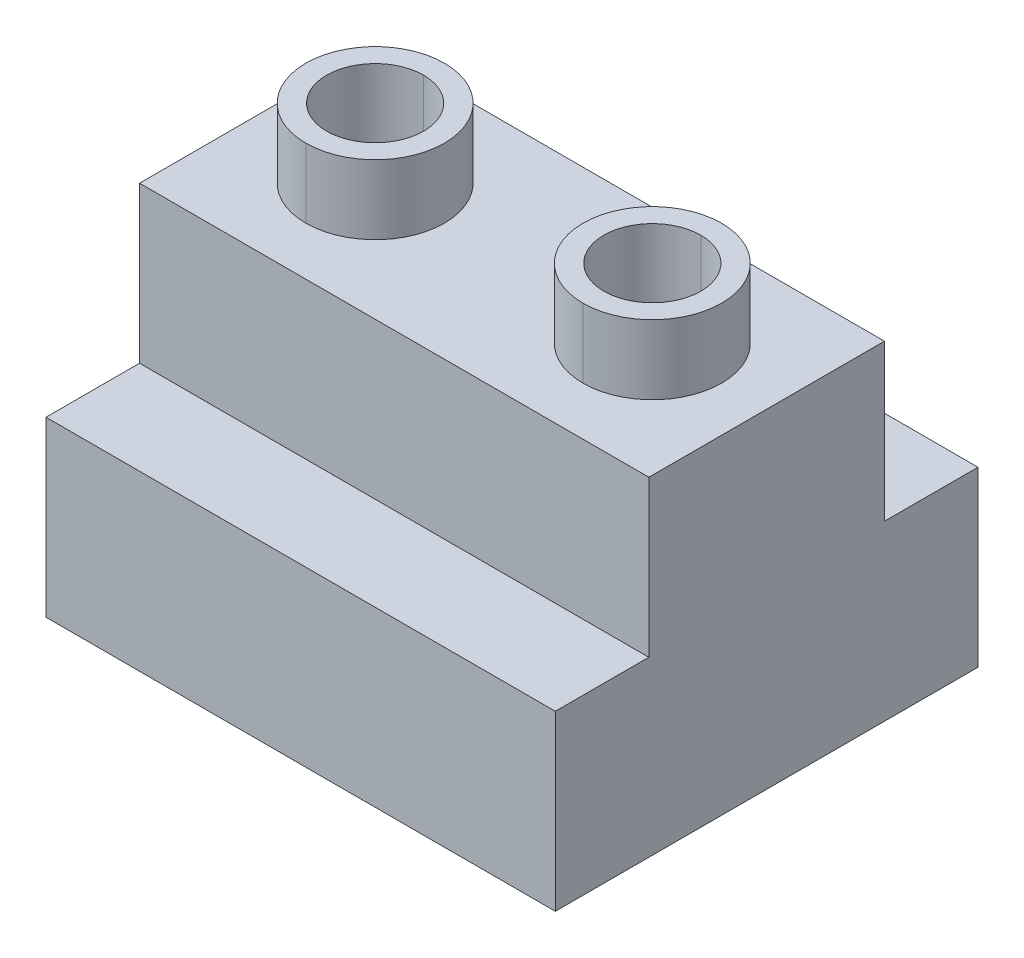
ISO-10303-21;
HEADER;
FILE_DESCRIPTION(('STEP AP214'),'2;1');
FILE_NAME('part.step','',(''),(''),'','','');
FILE_SCHEMA(('AUTOMOTIVE_DESIGN { 1 0 10303 214 1 1 1 1 }'));
ENDSEC;
DATA;
#1=APPLICATION_CONTEXT('core data for automotive mechanical design processes');
#2=APPLICATION_PROTOCOL_DEFINITION('international standard','automotive_design',2000,#1);
#3=PRODUCT_CONTEXT('',#1,'mechanical');
#4=PRODUCT('Part','Part','',(#3));
#5=PRODUCT_RELATED_PRODUCT_CATEGORY('part','',(#4));
#6=PRODUCT_DEFINITION_FORMATION('','',#4);
#7=PRODUCT_DEFINITION_CONTEXT('part definition',#1,'design');
#8=PRODUCT_DEFINITION('design','',#6,#7);
#9=PRODUCT_DEFINITION_SHAPE('','',#8);
#10=(LENGTH_UNIT() NAMED_UNIT(*) SI_UNIT(.MILLI.,.METRE.));
#11=(NAMED_UNIT(*) PLANE_ANGLE_UNIT() SI_UNIT($,.RADIAN.));
#12=(NAMED_UNIT(*) SI_UNIT($,.STERADIAN.) SOLID_ANGLE_UNIT());
#13=UNCERTAINTY_MEASURE_WITH_UNIT(LENGTH_MEASURE(1.E-05),#10,'distance_accuracy_value','');
#14=(GEOMETRIC_REPRESENTATION_CONTEXT(3) GLOBAL_UNCERTAINTY_ASSIGNED_CONTEXT((#13)) GLOBAL_UNIT_ASSIGNED_CONTEXT((#10,
#11,#12)) REPRESENTATION_CONTEXT('',''));
#15=CARTESIAN_POINT('',(0.,0.,0.));
#16=DIRECTION('',(0.,0.,1.));
#17=DIRECTION('',(1.,0.,0.));
#18=AXIS2_PLACEMENT_3D('',#15,#16,#17);
#19=CARTESIAN_POINT('',(-14.7,5.,3.4));
#20=DIRECTION('',(0.,1.,0.));
#21=DIRECTION('',(0.,0.,1.));
#22=AXIS2_PLACEMENT_3D('',#19,#20,#21);
#23=PLANE('',#22);
#24=DIRECTION('',(0.,0.,1.));
#25=VECTOR('',#24,1.);
#26=CARTESIAN_POINT('',(0.,5.,3.4));
#27=LINE('',#26,#25);
#28=CARTESIAN_POINT('',(0.,5.,3.4));
#29=VERTEX_POINT('',#28);
#30=CARTESIAN_POINT('',(0.,5.,6.1));
#31=VERTEX_POINT('',#30);
#32=EDGE_CURVE('E11',#29,#31,#27,.T.);
#33=ORIENTED_EDGE('',*,*,#32,.F.);
#34=DIRECTION('',(1.,0.,0.));
#35=VECTOR('',#34,1.);
#36=CARTESIAN_POINT('',(-14.7,5.,3.4));
#37=LINE('',#36,#35);
#38=CARTESIAN_POINT('',(-14.7,5.,3.4));
#39=VERTEX_POINT('',#38);
#40=EDGE_CURVE('E24',#39,#29,#37,.T.);
#41=ORIENTED_EDGE('',*,*,#40,.F.);
#42=DIRECTION('',(0.,0.,1.));
#43=VECTOR('',#42,1.);
#44=CARTESIAN_POINT('',(-14.7,5.,3.4));
#45=LINE('',#44,#43);
#46=CARTESIAN_POINT('',(-14.7,5.,6.1));
#47=VERTEX_POINT('',#46);
#48=EDGE_CURVE('E445',#39,#47,#45,.T.);
#49=ORIENTED_EDGE('',*,*,#48,.T.);
#50=DIRECTION('',(1.,0.,0.));
#51=VECTOR('',#50,1.);
#52=CARTESIAN_POINT('',(-14.7,5.,6.1));
#53=LINE('',#52,#51);
#54=EDGE_CURVE('E441',#47,#31,#53,.T.);
#55=ORIENTED_EDGE('',*,*,#54,.T.);
#56=EDGE_LOOP('',(#33,#41,#49,#55));
#57=FACE_BOUND('',#56,.T.);
#58=ADVANCED_FACE('F16',(#57),#23,.T.);
#59=CARTESIAN_POINT('',(-14.7,5.,6.1));
#60=DIRECTION('',(0.,0.,1.));
#61=DIRECTION('',(1.,0.,0.));
#62=AXIS2_PLACEMENT_3D('',#59,#60,#61);
#63=PLANE('',#62);
#64=DIRECTION('',(0.,-1.,0.));
#65=VECTOR('',#64,1.);
#66=CARTESIAN_POINT('',(0.,5.,6.1));
#67=LINE('',#66,#65);
#68=CARTESIAN_POINT('',(0.,0.,6.1));
#69=VERTEX_POINT('',#68);
#70=EDGE_CURVE('E436',#31,#69,#67,.T.);
#71=ORIENTED_EDGE('',*,*,#70,.F.);
#72=ORIENTED_EDGE('',*,*,#54,.F.);
#73=DIRECTION('',(0.,-1.,0.));
#74=VECTOR('',#73,1.);
#75=CARTESIAN_POINT('',(-14.7,5.,6.1));
#76=LINE('',#75,#74);
#77=CARTESIAN_POINT('',(-14.7,0.,6.1));
#78=VERTEX_POINT('',#77);
#79=EDGE_CURVE('E432',#47,#78,#76,.T.);
#80=ORIENTED_EDGE('',*,*,#79,.T.);
#81=DIRECTION('',(1.,0.,0.));
#82=VECTOR('',#81,1.);
#83=CARTESIAN_POINT('',(-14.7,0.,6.1));
#84=LINE('',#83,#82);
#85=EDGE_CURVE('E428',#78,#69,#84,.T.);
#86=ORIENTED_EDGE('',*,*,#85,.T.);
#87=EDGE_LOOP('',(#71,#72,#80,#86));
#88=FACE_BOUND('',#87,.T.);
#89=ADVANCED_FACE('F475',(#88),#63,.T.);
#90=CARTESIAN_POINT('',(-14.7,0.,6.1));
#91=DIRECTION('',(0.,-1.,0.));
#92=DIRECTION('',(0.,0.,-1.));
#93=AXIS2_PLACEMENT_3D('',#90,#91,#92);
#94=PLANE('',#93);
#95=DIRECTION('',(0.,0.,-1.));
#96=VECTOR('',#95,1.);
#97=CARTESIAN_POINT('',(0.,0.,6.1));
#98=LINE('',#97,#96);
#99=CARTESIAN_POINT('',(0.,0.,-6.1));
#100=VERTEX_POINT('',#99);
#101=EDGE_CURVE('E423',#69,#100,#98,.T.);
#102=ORIENTED_EDGE('',*,*,#101,.F.);
#103=ORIENTED_EDGE('',*,*,#85,.F.);
#104=DIRECTION('',(0.,0.,-1.));
#105=VECTOR('',#104,1.);
#106=CARTESIAN_POINT('',(-14.7,0.,6.1));
#107=LINE('',#106,#105);
#108=CARTESIAN_POINT('',(-14.7,0.,-6.1));
#109=VERTEX_POINT('',#108);
#110=EDGE_CURVE('E419',#78,#109,#107,.T.);
#111=ORIENTED_EDGE('',*,*,#110,.T.);
#112=DIRECTION('',(1.,0.,0.));
#113=VECTOR('',#112,1.);
#114=CARTESIAN_POINT('',(-14.7,0.,-6.1));
#115=LINE('',#114,#113);
#116=EDGE_CURVE('E415',#109,#100,#115,.T.);
#117=ORIENTED_EDGE('',*,*,#116,.T.);
#118=EDGE_LOOP('',(#102,#103,#111,#117));
#119=FACE_BOUND('',#118,.T.);
#120=ADVANCED_FACE('F480',(#119),#94,.T.);
#121=CARTESIAN_POINT('',(-14.7,0.,-6.1));
#122=DIRECTION('',(0.,0.,-1.));
#123=DIRECTION('',(-1.,0.,0.));
#124=AXIS2_PLACEMENT_3D('',#121,#122,#123);
#125=PLANE('',#124);
#126=DIRECTION('',(0.,1.,0.));
#127=VECTOR('',#126,1.);
#128=CARTESIAN_POINT('',(0.,0.,-6.1));
#129=LINE('',#128,#127);
#130=CARTESIAN_POINT('',(0.,5.,-6.1));
#131=VERTEX_POINT('',#130);
#132=EDGE_CURVE('E410',#100,#131,#129,.T.);
#133=ORIENTED_EDGE('',*,*,#132,.F.);
#134=ORIENTED_EDGE('',*,*,#116,.F.);
#135=DIRECTION('',(0.,1.,0.));
#136=VECTOR('',#135,1.);
#137=CARTESIAN_POINT('',(-14.7,0.,-6.1));
#138=LINE('',#137,#136);
#139=CARTESIAN_POINT('',(-14.7,5.,-6.1));
#140=VERTEX_POINT('',#139);
#141=EDGE_CURVE('E406',#109,#140,#138,.T.);
#142=ORIENTED_EDGE('',*,*,#141,.T.);
#143=DIRECTION('',(1.,0.,0.));
#144=VECTOR('',#143,1.);
#145=CARTESIAN_POINT('',(-14.7,5.,-6.1));
#146=LINE('',#145,#144);
#147=EDGE_CURVE('E402',#140,#131,#146,.T.);
#148=ORIENTED_EDGE('',*,*,#147,.T.);
#149=EDGE_LOOP('',(#133,#134,#142,#148));
#150=FACE_BOUND('',#149,.T.);
#151=ADVANCED_FACE('F484',(#150),#125,.T.);
#152=CARTESIAN_POINT('',(-14.7,5.,-6.1));
#153=DIRECTION('',(0.,1.,0.));
#154=DIRECTION('',(0.,0.,1.));
#155=AXIS2_PLACEMENT_3D('',#152,#153,#154);
#156=PLANE('',#155);
#157=DIRECTION('',(0.,0.,1.));
#158=VECTOR('',#157,1.);
#159=CARTESIAN_POINT('',(0.,5.,-6.1));
#160=LINE('',#159,#158);
#161=CARTESIAN_POINT('',(0.,5.,-3.4));
#162=VERTEX_POINT('',#161);
#163=EDGE_CURVE('E397',#131,#162,#160,.T.);
#164=ORIENTED_EDGE('',*,*,#163,.F.);
#165=ORIENTED_EDGE('',*,*,#147,.F.);
#166=DIRECTION('',(0.,0.,1.));
#167=VECTOR('',#166,1.);
#168=CARTESIAN_POINT('',(-14.7,5.,-6.1));
#169=LINE('',#168,#167);
#170=CARTESIAN_POINT('',(-14.7,5.,-3.4));
#171=VERTEX_POINT('',#170);
#172=EDGE_CURVE('E393',#140,#171,#169,.T.);
#173=ORIENTED_EDGE('',*,*,#172,.T.);
#174=DIRECTION('',(1.,0.,0.));
#175=VECTOR('',#174,1.);
#176=CARTESIAN_POINT('',(-14.7,5.,-3.4));
#177=LINE('',#176,#175);
#178=EDGE_CURVE('E389',#171,#162,#177,.T.);
#179=ORIENTED_EDGE('',*,*,#178,.T.);
#180=EDGE_LOOP('',(#164,#165,#173,#179));
#181=FACE_BOUND('',#180,.T.);
#182=ADVANCED_FACE('F489',(#181),#156,.T.);
#183=CARTESIAN_POINT('',(-14.7,5.,-3.4));
#184=DIRECTION('',(0.,0.,-1.));
#185=DIRECTION('',(-1.,0.,0.));
#186=AXIS2_PLACEMENT_3D('',#183,#184,#185);
#187=PLANE('',#186);
#188=DIRECTION('',(0.,1.,0.));
#189=VECTOR('',#188,1.);
#190=CARTESIAN_POINT('',(0.,5.,-3.4));
#191=LINE('',#190,#189);
#192=CARTESIAN_POINT('',(0.,9.5,-3.4));
#193=VERTEX_POINT('',#192);
#194=EDGE_CURVE('E384',#162,#193,#191,.T.);
#195=ORIENTED_EDGE('',*,*,#194,.F.);
#196=ORIENTED_EDGE('',*,*,#178,.F.);
#197=DIRECTION('',(0.,1.,0.));
#198=VECTOR('',#197,1.);
#199=CARTESIAN_POINT('',(-14.7,5.,-3.4));
#200=LINE('',#199,#198);
#201=CARTESIAN_POINT('',(-14.7,9.5,-3.4));
#202=VERTEX_POINT('',#201);
#203=EDGE_CURVE('E380',#171,#202,#200,.T.);
#204=ORIENTED_EDGE('',*,*,#203,.T.);
#205=DIRECTION('',(1.,0.,0.));
#206=VECTOR('',#205,1.);
#207=CARTESIAN_POINT('',(-14.7,9.5,-3.4));
#208=LINE('',#207,#206);
#209=EDGE_CURVE('E376',#202,#193,#208,.T.);
#210=ORIENTED_EDGE('',*,*,#209,.T.);
#211=EDGE_LOOP('',(#195,#196,#204,#210));
#212=FACE_BOUND('',#211,.T.);
#213=ADVANCED_FACE('F492',(#212),#187,.T.);
#214=CARTESIAN_POINT('',(-14.7,9.5,-3.4));
#215=DIRECTION('',(0.,1.,0.));
#216=DIRECTION('',(0.,0.,1.));
#217=AXIS2_PLACEMENT_3D('',#214,#215,#216);
#218=PLANE('',#217);
#219=CARTESIAN_POINT('',(-11.3,9.5,0.));
#220=DIRECTION('',(0.,1.,0.));
#221=DIRECTION('',(0.,0.,1.));
#222=AXIS2_PLACEMENT_3D('',#219,#220,#221);
#223=CIRCLE('',#222,2.);
#224=CARTESIAN_POINT('',(-11.3,9.5,-2.));
#225=VERTEX_POINT('',#224);
#226=CARTESIAN_POINT('',(-11.3,9.5,2.));
#227=VERTEX_POINT('',#226);
#228=EDGE_CURVE('E371',#225,#227,#223,.T.);
#229=ORIENTED_EDGE('',*,*,#228,.F.);
#230=CARTESIAN_POINT('',(-11.3,9.5,0.));
#231=DIRECTION('',(0.,1.,0.));
#232=DIRECTION('',(0.,0.,1.));
#233=AXIS2_PLACEMENT_3D('',#230,#231,#232);
#234=CIRCLE('',#233,2.);
#235=EDGE_CURVE('E366',#227,#225,#234,.T.);
#236=ORIENTED_EDGE('',*,*,#235,.F.);
#237=EDGE_LOOP('',(#229,#236));
#238=FACE_BOUND('',#237,.T.);
#239=CARTESIAN_POINT('',(-3.3,9.5,0.));
#240=DIRECTION('',(0.,1.,0.));
#241=DIRECTION('',(0.,0.,1.));
#242=AXIS2_PLACEMENT_3D('',#239,#240,#241);
#243=CIRCLE('',#242,2.);
#244=CARTESIAN_POINT('',(-3.3,9.5,-2.));
#245=VERTEX_POINT('',#244);
#246=CARTESIAN_POINT('',(-3.3,9.5,2.));
#247=VERTEX_POINT('',#246);
#248=EDGE_CURVE('E361',#245,#247,#243,.T.);
#249=ORIENTED_EDGE('',*,*,#248,.F.);
#250=CARTESIAN_POINT('',(-3.3,9.5,0.));
#251=DIRECTION('',(0.,1.,0.));
#252=DIRECTION('',(0.,0.,1.));
#253=AXIS2_PLACEMENT_3D('',#250,#251,#252);
#254=CIRCLE('',#253,2.);
#255=EDGE_CURVE('E356',#247,#245,#254,.T.);
#256=ORIENTED_EDGE('',*,*,#255,.F.);
#257=EDGE_LOOP('',(#249,#256));
#258=FACE_BOUND('',#257,.T.);
#259=DIRECTION('',(0.,0.,1.));
#260=VECTOR('',#259,1.);
#261=CARTESIAN_POINT('',(0.,9.5,-3.4));
#262=LINE('',#261,#260);
#263=CARTESIAN_POINT('',(0.,9.5,3.4));
#264=VERTEX_POINT('',#263);
#265=EDGE_CURVE('E351',#193,#264,#262,.T.);
#266=ORIENTED_EDGE('',*,*,#265,.F.);
#267=ORIENTED_EDGE('',*,*,#209,.F.);
#268=DIRECTION('',(0.,0.,1.));
#269=VECTOR('',#268,1.);
#270=CARTESIAN_POINT('',(-14.7,9.5,-3.4));
#271=LINE('',#270,#269);
#272=CARTESIAN_POINT('',(-14.7,9.5,3.4));
#273=VERTEX_POINT('',#272);
#274=EDGE_CURVE('E347',#202,#273,#271,.T.);
#275=ORIENTED_EDGE('',*,*,#274,.T.);
#276=DIRECTION('',(1.,0.,0.));
#277=VECTOR('',#276,1.);
#278=CARTESIAN_POINT('',(-14.7,9.5,3.4));
#279=LINE('',#278,#277);
#280=EDGE_CURVE('E343',#273,#264,#279,.T.);
#281=ORIENTED_EDGE('',*,*,#280,.T.);
#282=EDGE_LOOP('',(#266,#267,#275,#281));
#283=FACE_BOUND('',#282,.T.);
#284=ADVANCED_FACE('F465',(#238,#258,#283),#218,.T.);
#285=CARTESIAN_POINT('',(-14.7,9.5,3.4));
#286=DIRECTION('',(0.,0.,1.));
#287=DIRECTION('',(1.,0.,0.));
#288=AXIS2_PLACEMENT_3D('',#285,#286,#287);
#289=PLANE('',#288);
#290=DIRECTION('',(0.,-1.,0.));
#291=VECTOR('',#290,1.);
#292=CARTESIAN_POINT('',(0.,9.5,3.4));
#293=LINE('',#292,#291);
#294=EDGE_CURVE('E338',#264,#29,#293,.T.);
#295=ORIENTED_EDGE('',*,*,#294,.F.);
#296=ORIENTED_EDGE('',*,*,#280,.F.);
#297=DIRECTION('',(0.,-1.,0.));
#298=VECTOR('',#297,1.);
#299=CARTESIAN_POINT('',(-14.7,9.5,3.4));
#300=LINE('',#299,#298);
#301=EDGE_CURVE('E334',#273,#39,#300,.T.);
#302=ORIENTED_EDGE('',*,*,#301,.T.);
#303=ORIENTED_EDGE('',*,*,#40,.T.);
#304=EDGE_LOOP('',(#295,#296,#302,#303));
#305=FACE_BOUND('',#304,.T.);
#306=ADVANCED_FACE('F455',(#305),#289,.T.);
#307=CARTESIAN_POINT('',(-14.7,0.,0.));
#308=DIRECTION('',(1.,0.,0.));
#309=DIRECTION('',(0.,0.,-1.));
#310=AXIS2_PLACEMENT_3D('',#307,#308,#309);
#311=PLANE('',#310);
#312=ORIENTED_EDGE('',*,*,#48,.F.);
#313=ORIENTED_EDGE('',*,*,#301,.F.);
#314=ORIENTED_EDGE('',*,*,#274,.F.);
#315=ORIENTED_EDGE('',*,*,#203,.F.);
#316=ORIENTED_EDGE('',*,*,#172,.F.);
#317=ORIENTED_EDGE('',*,*,#141,.F.);
#318=ORIENTED_EDGE('',*,*,#110,.F.);
#319=ORIENTED_EDGE('',*,*,#79,.F.);
#320=EDGE_LOOP('',(#312,#313,#314,#315,#316,#317,#318,#319));
#321=FACE_BOUND('',#320,.T.);
#322=ADVANCED_FACE('F469',(#321),#311,.F.);
#323=CARTESIAN_POINT('',(0.,0.,0.));
#324=DIRECTION('',(1.,0.,0.));
#325=DIRECTION('',(0.,0.,-1.));
#326=AXIS2_PLACEMENT_3D('',#323,#324,#325);
#327=PLANE('',#326);
#328=ORIENTED_EDGE('',*,*,#32,.T.);
#329=ORIENTED_EDGE('',*,*,#70,.T.);
#330=ORIENTED_EDGE('',*,*,#101,.T.);
#331=ORIENTED_EDGE('',*,*,#132,.T.);
#332=ORIENTED_EDGE('',*,*,#163,.T.);
#333=ORIENTED_EDGE('',*,*,#194,.T.);
#334=ORIENTED_EDGE('',*,*,#265,.T.);
#335=ORIENTED_EDGE('',*,*,#294,.T.);
#336=EDGE_LOOP('',(#328,#329,#330,#331,#332,#333,#334,#335));
#337=FACE_BOUND('',#336,.T.);
#338=ADVANCED_FACE('F460',(#337),#327,.T.);
#339=CARTESIAN_POINT('',(-3.3,50.,0.));
#340=DIRECTION('',(0.,1.,0.));
#341=DIRECTION('',(-1.,0.,0.));
#342=AXIS2_PLACEMENT_3D('',#339,#340,#341);
#343=CYLINDRICAL_SURFACE('',#342,2.);
#344=DIRECTION('',(0.,1.,0.));
#345=VECTOR('',#344,1.);
#346=CARTESIAN_POINT('',(-3.3,9.5,-2.));
#347=LINE('',#346,#345);
#348=CARTESIAN_POINT('',(-3.3,11.5,-2.));
#349=VERTEX_POINT('',#348);
#350=EDGE_CURVE('E330',#245,#349,#347,.T.);
#351=ORIENTED_EDGE('',*,*,#350,.T.);
#352=CARTESIAN_POINT('',(-3.3,11.5,0.));
#353=DIRECTION('',(0.,1.,0.));
#354=DIRECTION('',(0.,0.,1.));
#355=AXIS2_PLACEMENT_3D('',#352,#353,#354);
#356=CIRCLE('',#355,2.);
#357=CARTESIAN_POINT('',(-3.3,11.5,2.));
#358=VERTEX_POINT('',#357);
#359=EDGE_CURVE('E325',#358,#349,#356,.T.);
#360=ORIENTED_EDGE('',*,*,#359,.F.);
#361=DIRECTION('',(0.,1.,0.));
#362=VECTOR('',#361,1.);
#363=CARTESIAN_POINT('',(-3.3,9.5,2.));
#364=LINE('',#363,#362);
#365=EDGE_CURVE('E320',#247,#358,#364,.T.);
#366=ORIENTED_EDGE('',*,*,#365,.F.);
#367=ORIENTED_EDGE('',*,*,#255,.T.);
#368=EDGE_LOOP('',(#351,#360,#366,#367));
#369=FACE_BOUND('',#368,.T.);
#370=ADVANCED_FACE('F567',(#369),#343,.T.);
#371=CARTESIAN_POINT('',(-3.3,50.,0.));
#372=DIRECTION('',(0.,1.,0.));
#373=DIRECTION('',(1.,0.,0.));
#374=AXIS2_PLACEMENT_3D('',#371,#372,#373);
#375=CYLINDRICAL_SURFACE('',#374,2.);
#376=ORIENTED_EDGE('',*,*,#350,.F.);
#377=ORIENTED_EDGE('',*,*,#248,.T.);
#378=ORIENTED_EDGE('',*,*,#365,.T.);
#379=CARTESIAN_POINT('',(-3.3,11.5,0.));
#380=DIRECTION('',(0.,1.,0.));
#381=DIRECTION('',(0.,0.,1.));
#382=AXIS2_PLACEMENT_3D('',#379,#380,#381);
#383=CIRCLE('',#382,2.);
#384=EDGE_CURVE('E315',#349,#358,#383,.T.);
#385=ORIENTED_EDGE('',*,*,#384,.F.);
#386=EDGE_LOOP('',(#376,#377,#378,#385));
#387=FACE_BOUND('',#386,.T.);
#388=ADVANCED_FACE('F577',(#387),#375,.T.);
#389=CARTESIAN_POINT('',(-4.7,11.5,0.));
#390=DIRECTION('',(0.,1.,0.));
#391=DIRECTION('',(0.,0.,1.));
#392=AXIS2_PLACEMENT_3D('',#389,#390,#391);
#393=PLANE('',#392);
#394=ORIENTED_EDGE('',*,*,#359,.T.);
#395=ORIENTED_EDGE('',*,*,#384,.T.);
#396=EDGE_LOOP('',(#394,#395));
#397=FACE_BOUND('',#396,.T.);
#398=CARTESIAN_POINT('',(-3.3,11.5,0.));
#399=DIRECTION('',(0.,1.,0.));
#400=DIRECTION('',(0.,0.,1.));
#401=AXIS2_PLACEMENT_3D('',#398,#399,#400);
#402=CIRCLE('',#401,1.4);
#403=CARTESIAN_POINT('',(-3.3,11.5,-1.4));
#404=VERTEX_POINT('',#403);
#405=CARTESIAN_POINT('',(-3.3,11.5,1.4));
#406=VERTEX_POINT('',#405);
#407=EDGE_CURVE('E310',#404,#406,#402,.T.);
#408=ORIENTED_EDGE('',*,*,#407,.F.);
#409=CARTESIAN_POINT('',(-3.3,11.5,0.));
#410=DIRECTION('',(0.,1.,0.));
#411=DIRECTION('',(0.,0.,1.));
#412=AXIS2_PLACEMENT_3D('',#409,#410,#411);
#413=CIRCLE('',#412,1.4);
#414=EDGE_CURVE('E305',#406,#404,#413,.T.);
#415=ORIENTED_EDGE('',*,*,#414,.F.);
#416=EDGE_LOOP('',(#408,#415));
#417=FACE_BOUND('',#416,.T.);
#418=ADVANCED_FACE('F588',(#397,#417),#393,.T.);
#419=CARTESIAN_POINT('',(-3.3,50.,0.));
#420=DIRECTION('',(0.,1.,0.));
#421=DIRECTION('',(-1.,0.,0.));
#422=AXIS2_PLACEMENT_3D('',#419,#420,#421);
#423=CYLINDRICAL_SURFACE('',#422,1.4);
#424=DIRECTION('',(0.,1.,0.));
#425=VECTOR('',#424,1.);
#426=CARTESIAN_POINT('',(-3.3,7.5,-1.4));
#427=LINE('',#426,#425);
#428=CARTESIAN_POINT('',(-3.3,7.5,-1.4));
#429=VERTEX_POINT('',#428);
#430=EDGE_CURVE('E300',#429,#404,#427,.T.);
#431=ORIENTED_EDGE('',*,*,#430,.F.);
#432=CARTESIAN_POINT('',(-3.3,7.5,0.));
#433=DIRECTION('',(0.,1.,0.));
#434=DIRECTION('',(0.,0.,1.));
#435=AXIS2_PLACEMENT_3D('',#432,#433,#434);
#436=CIRCLE('',#435,1.4);
#437=CARTESIAN_POINT('',(-3.3,7.5,1.4));
#438=VERTEX_POINT('',#437);
#439=EDGE_CURVE('E295',#438,#429,#436,.T.);
#440=ORIENTED_EDGE('',*,*,#439,.F.);
#441=DIRECTION('',(0.,1.,0.));
#442=VECTOR('',#441,1.);
#443=CARTESIAN_POINT('',(-3.3,7.5,1.4));
#444=LINE('',#443,#442);
#445=EDGE_CURVE('E290',#438,#406,#444,.T.);
#446=ORIENTED_EDGE('',*,*,#445,.T.);
#447=ORIENTED_EDGE('',*,*,#414,.T.);
#448=EDGE_LOOP('',(#431,#440,#446,#447));
#449=FACE_BOUND('',#448,.T.);
#450=ADVANCED_FACE('F599',(#449),#423,.F.);
#451=CARTESIAN_POINT('',(-3.3,50.,0.));
#452=DIRECTION('',(0.,1.,0.));
#453=DIRECTION('',(1.,0.,0.));
#454=AXIS2_PLACEMENT_3D('',#451,#452,#453);
#455=CYLINDRICAL_SURFACE('',#454,1.4);
#456=ORIENTED_EDGE('',*,*,#430,.T.);
#457=ORIENTED_EDGE('',*,*,#407,.T.);
#458=ORIENTED_EDGE('',*,*,#445,.F.);
#459=CARTESIAN_POINT('',(-3.3,7.5,0.));
#460=DIRECTION('',(0.,1.,0.));
#461=DIRECTION('',(0.,0.,1.));
#462=AXIS2_PLACEMENT_3D('',#459,#460,#461);
#463=CIRCLE('',#462,1.4);
#464=EDGE_CURVE('E285',#429,#438,#463,.T.);
#465=ORIENTED_EDGE('',*,*,#464,.F.);
#466=EDGE_LOOP('',(#456,#457,#458,#465));
#467=FACE_BOUND('',#466,.T.);
#468=ADVANCED_FACE('F610',(#467),#455,.F.);
#469=CARTESIAN_POINT('',(-4.3065,7.5,0.));
#470=DIRECTION('',(0.,1.,0.));
#471=DIRECTION('',(0.,0.,1.));
#472=AXIS2_PLACEMENT_3D('',#469,#470,#471);
#473=PLANE('',#472);
#474=ORIENTED_EDGE('',*,*,#439,.T.);
#475=ORIENTED_EDGE('',*,*,#464,.T.);
#476=EDGE_LOOP('',(#474,#475));
#477=FACE_BOUND('',#476,.T.);
#478=CARTESIAN_POINT('',(-3.3,7.5,0.));
#479=DIRECTION('',(0.,1.,0.));
#480=DIRECTION('',(0.,0.,1.));
#481=AXIS2_PLACEMENT_3D('',#478,#479,#480);
#482=CIRCLE('',#481,1.0065);
#483=CARTESIAN_POINT('',(-3.3,7.5,-1.0065));
#484=VERTEX_POINT('',#483);
#485=CARTESIAN_POINT('',(-3.3,7.5,1.0065));
#486=VERTEX_POINT('',#485);
#487=EDGE_CURVE('E280',#484,#486,#482,.T.);
#488=ORIENTED_EDGE('',*,*,#487,.F.);
#489=CARTESIAN_POINT('',(-3.3,7.5,0.));
#490=DIRECTION('',(0.,1.,0.));
#491=DIRECTION('',(0.,0.,1.));
#492=AXIS2_PLACEMENT_3D('',#489,#490,#491);
#493=CIRCLE('',#492,1.0065);
#494=EDGE_CURVE('E275',#486,#484,#493,.T.);
#495=ORIENTED_EDGE('',*,*,#494,.F.);
#496=EDGE_LOOP('',(#488,#495));
#497=FACE_BOUND('',#496,.T.);
#498=ADVANCED_FACE('F621',(#477,#497),#473,.T.);
#499=CARTESIAN_POINT('',(-3.3,9.5,0.));
#500=DIRECTION('',(0.,1.,0.));
#501=DIRECTION('',(-1.,0.,0.));
#502=AXIS2_PLACEMENT_3D('',#499,#500,#501);
#503=CYLINDRICAL_SURFACE('',#502,1.0065);
#504=DIRECTION('',(0.,1.,0.));
#505=VECTOR('',#504,1.);
#506=CARTESIAN_POINT('',(-3.3,2.8594152094523,-1.0065));
#507=LINE('',#506,#505);
#508=CARTESIAN_POINT('',(-3.3,2.8594152094523,-1.0065));
#509=VERTEX_POINT('',#508);
#510=EDGE_CURVE('E270',#509,#484,#507,.T.);
#511=ORIENTED_EDGE('',*,*,#510,.F.);
#512=CARTESIAN_POINT('',(-3.3,2.8594152094523,0.));
#513=DIRECTION('',(0.,1.,0.));
#514=DIRECTION('',(0.,0.,1.));
#515=AXIS2_PLACEMENT_3D('',#512,#513,#514);
#516=CIRCLE('',#515,1.0065);
#517=CARTESIAN_POINT('',(-3.3,2.8594152094523,1.0065));
#518=VERTEX_POINT('',#517);
#519=EDGE_CURVE('E265',#518,#509,#516,.T.);
#520=ORIENTED_EDGE('',*,*,#519,.F.);
#521=DIRECTION('',(0.,1.,0.));
#522=VECTOR('',#521,1.);
#523=CARTESIAN_POINT('',(-3.3,2.8594152094523,1.0065));
#524=LINE('',#523,#522);
#525=EDGE_CURVE('E260',#518,#486,#524,.T.);
#526=ORIENTED_EDGE('',*,*,#525,.T.);
#527=ORIENTED_EDGE('',*,*,#494,.T.);
#528=EDGE_LOOP('',(#511,#520,#526,#527));
#529=FACE_BOUND('',#528,.T.);
#530=ADVANCED_FACE('F632',(#529),#503,.F.);
#531=CARTESIAN_POINT('',(-3.3,9.5,0.));
#532=DIRECTION('',(0.,1.,0.));
#533=DIRECTION('',(1.,0.,0.));
#534=AXIS2_PLACEMENT_3D('',#531,#532,#533);
#535=CYLINDRICAL_SURFACE('',#534,1.0065);
#536=ORIENTED_EDGE('',*,*,#510,.T.);
#537=ORIENTED_EDGE('',*,*,#487,.T.);
#538=ORIENTED_EDGE('',*,*,#525,.F.);
#539=CARTESIAN_POINT('',(-3.3,2.8594152094523,0.));
#540=DIRECTION('',(0.,1.,0.));
#541=DIRECTION('',(0.,0.,1.));
#542=AXIS2_PLACEMENT_3D('',#539,#540,#541);
#543=CIRCLE('',#542,1.0065);
#544=EDGE_CURVE('E255',#509,#518,#543,.T.);
#545=ORIENTED_EDGE('',*,*,#544,.F.);
#546=EDGE_LOOP('',(#536,#537,#538,#545));
#547=FACE_BOUND('',#546,.T.);
#548=ADVANCED_FACE('F643',(#547),#535,.F.);
#549=CARTESIAN_POINT('',(-3.3,2.278312163513,0.));
#550=DIRECTION('',(0.,1.,0.));
#551=DIRECTION('',(1.,0.,0.));
#552=AXIS2_PLACEMENT_3D('',#549,#550,#551);
#553=CONICAL_SURFACE('',#552,0.,1.04719755119664);
#554=DIRECTION('',(0.,0.499999999999962,-0.866025403784461));
#555=VECTOR('',#554,1.);
#556=CARTESIAN_POINT('',(-3.3,2.278312163513,0.));
#557=LINE('',#556,#555);
#558=CARTESIAN_POINT('',(-3.3,2.278312163513,0.));
#559=VERTEX_POINT('',#558);
#560=EDGE_CURVE('E250',#559,#509,#557,.T.);
#561=ORIENTED_EDGE('',*,*,#560,.T.);
#562=ORIENTED_EDGE('',*,*,#544,.T.);
#563=DIRECTION('',(0.,0.499999999999962,0.866025403784461));
#564=VECTOR('',#563,1.);
#565=CARTESIAN_POINT('',(-3.3,2.278312163513,0.));
#566=LINE('',#565,#564);
#567=EDGE_CURVE('E245',#559,#518,#566,.T.);
#568=ORIENTED_EDGE('',*,*,#567,.F.);
#569=EDGE_LOOP('',(#561,#562,#568));
#570=FACE_BOUND('',#569,.T.);
#571=ADVANCED_FACE('F654',(#570),#553,.F.);
#572=CARTESIAN_POINT('',(-3.3,2.278312163513,0.));
#573=DIRECTION('',(0.,1.,0.));
#574=DIRECTION('',(-1.,0.,0.));
#575=AXIS2_PLACEMENT_3D('',#572,#573,#574);
#576=CONICAL_SURFACE('',#575,0.,1.04719755119664);
#577=ORIENTED_EDGE('',*,*,#567,.T.);
#578=ORIENTED_EDGE('',*,*,#519,.T.);
#579=ORIENTED_EDGE('',*,*,#560,.F.);
#580=EDGE_LOOP('',(#577,#578,#579));
#581=FACE_BOUND('',#580,.T.);
#582=ADVANCED_FACE('F665',(#581),#576,.F.);
#583=CARTESIAN_POINT('',(-11.3,50.,0.));
#584=DIRECTION('',(0.,1.,0.));
#585=DIRECTION('',(-1.,0.,0.));
#586=AXIS2_PLACEMENT_3D('',#583,#584,#585);
#587=CYLINDRICAL_SURFACE('',#586,2.);
#588=DIRECTION('',(0.,1.,0.));
#589=VECTOR('',#588,1.);
#590=CARTESIAN_POINT('',(-11.3,9.5,-2.));
#591=LINE('',#590,#589);
#592=CARTESIAN_POINT('',(-11.3,11.5,-2.));
#593=VERTEX_POINT('',#592);
#594=EDGE_CURVE('E241',#225,#593,#591,.T.);
#595=ORIENTED_EDGE('',*,*,#594,.T.);
#596=CARTESIAN_POINT('',(-11.3,11.5,0.));
#597=DIRECTION('',(0.,1.,0.));
#598=DIRECTION('',(0.,0.,1.));
#599=AXIS2_PLACEMENT_3D('',#596,#597,#598);
#600=CIRCLE('',#599,2.);
#601=CARTESIAN_POINT('',(-11.3,11.5,2.));
#602=VERTEX_POINT('',#601);
#603=EDGE_CURVE('E236',#602,#593,#600,.T.);
#604=ORIENTED_EDGE('',*,*,#603,.F.);
#605=DIRECTION('',(0.,1.,0.));
#606=VECTOR('',#605,1.);
#607=CARTESIAN_POINT('',(-11.3,9.5,2.));
#608=LINE('',#607,#606);
#609=EDGE_CURVE('E231',#227,#602,#608,.T.);
#610=ORIENTED_EDGE('',*,*,#609,.F.);
#611=ORIENTED_EDGE('',*,*,#235,.T.);
#612=EDGE_LOOP('',(#595,#604,#610,#611));
#613=FACE_BOUND('',#612,.T.);
#614=ADVANCED_FACE('F676',(#613),#587,.T.);
#615=CARTESIAN_POINT('',(-11.3,50.,0.));
#616=DIRECTION('',(0.,1.,0.));
#617=DIRECTION('',(1.,0.,0.));
#618=AXIS2_PLACEMENT_3D('',#615,#616,#617);
#619=CYLINDRICAL_SURFACE('',#618,2.);
#620=ORIENTED_EDGE('',*,*,#594,.F.);
#621=ORIENTED_EDGE('',*,*,#228,.T.);
#622=ORIENTED_EDGE('',*,*,#609,.T.);
#623=CARTESIAN_POINT('',(-11.3,11.5,0.));
#624=DIRECTION('',(0.,1.,0.));
#625=DIRECTION('',(0.,0.,1.));
#626=AXIS2_PLACEMENT_3D('',#623,#624,#625);
#627=CIRCLE('',#626,2.);
#628=EDGE_CURVE('E226',#593,#602,#627,.T.);
#629=ORIENTED_EDGE('',*,*,#628,.F.);
#630=EDGE_LOOP('',(#620,#621,#622,#629));
#631=FACE_BOUND('',#630,.T.);
#632=ADVANCED_FACE('F687',(#631),#619,.T.);
#633=CARTESIAN_POINT('',(-12.7,11.5,0.));
#634=DIRECTION('',(0.,1.,0.));
#635=DIRECTION('',(0.,0.,1.));
#636=AXIS2_PLACEMENT_3D('',#633,#634,#635);
#637=PLANE('',#636);
#638=ORIENTED_EDGE('',*,*,#603,.T.);
#639=ORIENTED_EDGE('',*,*,#628,.T.);
#640=EDGE_LOOP('',(#638,#639));
#641=FACE_BOUND('',#640,.T.);
#642=CARTESIAN_POINT('',(-11.3,11.5,0.));
#643=DIRECTION('',(0.,1.,0.));
#644=DIRECTION('',(0.,0.,1.));
#645=AXIS2_PLACEMENT_3D('',#642,#643,#644);
#646=CIRCLE('',#645,1.4);
#647=CARTESIAN_POINT('',(-11.3,11.5,-1.4));
#648=VERTEX_POINT('',#647);
#649=CARTESIAN_POINT('',(-11.3,11.5,1.4));
#650=VERTEX_POINT('',#649);
#651=EDGE_CURVE('E221',#648,#650,#646,.T.);
#652=ORIENTED_EDGE('',*,*,#651,.F.);
#653=CARTESIAN_POINT('',(-11.3,11.5,0.));
#654=DIRECTION('',(0.,1.,0.));
#655=DIRECTION('',(0.,0.,1.));
#656=AXIS2_PLACEMENT_3D('',#653,#654,#655);
#657=CIRCLE('',#656,1.4);
#658=EDGE_CURVE('E216',#650,#648,#657,.T.);
#659=ORIENTED_EDGE('',*,*,#658,.F.);
#660=EDGE_LOOP('',(#652,#659));
#661=FACE_BOUND('',#660,.T.);
#662=ADVANCED_FACE('F698',(#641,#661),#637,.T.);
#663=CARTESIAN_POINT('',(-11.3,50.,0.));
#664=DIRECTION('',(0.,1.,0.));
#665=DIRECTION('',(-1.,0.,0.));
#666=AXIS2_PLACEMENT_3D('',#663,#664,#665);
#667=CYLINDRICAL_SURFACE('',#666,1.4);
#668=DIRECTION('',(0.,1.,0.));
#669=VECTOR('',#668,1.);
#670=CARTESIAN_POINT('',(-11.3,7.5,-1.4));
#671=LINE('',#670,#669);
#672=CARTESIAN_POINT('',(-11.3,7.5,-1.4));
#673=VERTEX_POINT('',#672);
#674=EDGE_CURVE('E211',#673,#648,#671,.T.);
#675=ORIENTED_EDGE('',*,*,#674,.F.);
#676=CARTESIAN_POINT('',(-11.3,7.5,0.));
#677=DIRECTION('',(0.,1.,0.));
#678=DIRECTION('',(0.,0.,1.));
#679=AXIS2_PLACEMENT_3D('',#676,#677,#678);
#680=CIRCLE('',#679,1.4);
#681=CARTESIAN_POINT('',(-11.3,7.5,1.4));
#682=VERTEX_POINT('',#681);
#683=EDGE_CURVE('E206',#682,#673,#680,.T.);
#684=ORIENTED_EDGE('',*,*,#683,.F.);
#685=DIRECTION('',(0.,1.,0.));
#686=VECTOR('',#685,1.);
#687=CARTESIAN_POINT('',(-11.3,7.5,1.4));
#688=LINE('',#687,#686);
#689=EDGE_CURVE('E201',#682,#650,#688,.T.);
#690=ORIENTED_EDGE('',*,*,#689,.T.);
#691=ORIENTED_EDGE('',*,*,#658,.T.);
#692=EDGE_LOOP('',(#675,#684,#690,#691));
#693=FACE_BOUND('',#692,.T.);
#694=ADVANCED_FACE('F709',(#693),#667,.F.);
#695=CARTESIAN_POINT('',(-11.3,50.,0.));
#696=DIRECTION('',(0.,1.,0.));
#697=DIRECTION('',(1.,0.,0.));
#698=AXIS2_PLACEMENT_3D('',#695,#696,#697);
#699=CYLINDRICAL_SURFACE('',#698,1.4);
#700=ORIENTED_EDGE('',*,*,#674,.T.);
#701=ORIENTED_EDGE('',*,*,#651,.T.);
#702=ORIENTED_EDGE('',*,*,#689,.F.);
#703=CARTESIAN_POINT('',(-11.3,7.5,0.));
#704=DIRECTION('',(0.,1.,0.));
#705=DIRECTION('',(0.,0.,1.));
#706=AXIS2_PLACEMENT_3D('',#703,#704,#705);
#707=CIRCLE('',#706,1.4);
#708=EDGE_CURVE('E196',#673,#682,#707,.T.);
#709=ORIENTED_EDGE('',*,*,#708,.F.);
#710=EDGE_LOOP('',(#700,#701,#702,#709));
#711=FACE_BOUND('',#710,.T.);
#712=ADVANCED_FACE('F720',(#711),#699,.F.);
#713=CARTESIAN_POINT('',(-12.3065,7.5,0.));
#714=DIRECTION('',(0.,1.,0.));
#715=DIRECTION('',(0.,0.,1.));
#716=AXIS2_PLACEMENT_3D('',#713,#714,#715);
#717=PLANE('',#716);
#718=ORIENTED_EDGE('',*,*,#683,.T.);
#719=ORIENTED_EDGE('',*,*,#708,.T.);
#720=EDGE_LOOP('',(#718,#719));
#721=FACE_BOUND('',#720,.T.);
#722=CARTESIAN_POINT('',(-11.3,7.5,0.));
#723=DIRECTION('',(0.,1.,0.));
#724=DIRECTION('',(0.,0.,1.));
#725=AXIS2_PLACEMENT_3D('',#722,#723,#724);
#726=CIRCLE('',#725,1.0065);
#727=CARTESIAN_POINT('',(-11.3,7.5,-1.0065));
#728=VERTEX_POINT('',#727);
#729=CARTESIAN_POINT('',(-11.3,7.5,1.0065));
#730=VERTEX_POINT('',#729);
#731=EDGE_CURVE('E191',#728,#730,#726,.T.);
#732=ORIENTED_EDGE('',*,*,#731,.F.);
#733=CARTESIAN_POINT('',(-11.3,7.5,0.));
#734=DIRECTION('',(0.,1.,0.));
#735=DIRECTION('',(0.,0.,1.));
#736=AXIS2_PLACEMENT_3D('',#733,#734,#735);
#737=CIRCLE('',#736,1.0065);
#738=EDGE_CURVE('E186',#730,#728,#737,.T.);
#739=ORIENTED_EDGE('',*,*,#738,.F.);
#740=EDGE_LOOP('',(#732,#739));
#741=FACE_BOUND('',#740,.T.);
#742=ADVANCED_FACE('F731',(#721,#741),#717,.T.);
#743=CARTESIAN_POINT('',(-11.3,9.5,0.));
#744=DIRECTION('',(0.,1.,0.));
#745=DIRECTION('',(-1.,0.,0.));
#746=AXIS2_PLACEMENT_3D('',#743,#744,#745);
#747=CYLINDRICAL_SURFACE('',#746,1.0065);
#748=DIRECTION('',(0.,1.,0.));
#749=VECTOR('',#748,1.);
#750=CARTESIAN_POINT('',(-11.3,2.8594152094523,-1.0065));
#751=LINE('',#750,#749);
#752=CARTESIAN_POINT('',(-11.3,2.8594152094523,-1.0065));
#753=VERTEX_POINT('',#752);
#754=EDGE_CURVE('E181',#753,#728,#751,.T.);
#755=ORIENTED_EDGE('',*,*,#754,.F.);
#756=CARTESIAN_POINT('',(-11.3,2.8594152094523,0.));
#757=DIRECTION('',(0.,1.,0.));
#758=DIRECTION('',(0.,0.,1.));
#759=AXIS2_PLACEMENT_3D('',#756,#757,#758);
#760=CIRCLE('',#759,1.0065);
#761=CARTESIAN_POINT('',(-11.3,2.8594152094523,1.0065));
#762=VERTEX_POINT('',#761);
#763=EDGE_CURVE('E165',#762,#753,#760,.T.);
#764=ORIENTED_EDGE('',*,*,#763,.F.);
#765=DIRECTION('',(0.,1.,0.));
#766=VECTOR('',#765,1.);
#767=CARTESIAN_POINT('',(-11.3,2.8594152094523,1.0065));
#768=LINE('',#767,#766);
#769=EDGE_CURVE('E167',#762,#730,#768,.T.);
#770=ORIENTED_EDGE('',*,*,#769,.T.);
#771=ORIENTED_EDGE('',*,*,#738,.T.);
#772=EDGE_LOOP('',(#755,#764,#770,#771));
#773=FACE_BOUND('',#772,.T.);
#774=ADVANCED_FACE('F742',(#773),#747,.F.);
#775=CARTESIAN_POINT('',(-11.3,9.5,0.));
#776=DIRECTION('',(0.,1.,0.));
#777=DIRECTION('',(1.,0.,0.));
#778=AXIS2_PLACEMENT_3D('',#775,#776,#777);
#779=CYLINDRICAL_SURFACE('',#778,1.0065);
#780=ORIENTED_EDGE('',*,*,#754,.T.);
#781=ORIENTED_EDGE('',*,*,#731,.T.);
#782=ORIENTED_EDGE('',*,*,#769,.F.);
#783=CARTESIAN_POINT('',(-11.3,2.8594152094523,0.));
#784=DIRECTION('',(0.,1.,0.));
#785=DIRECTION('',(0.,0.,1.));
#786=AXIS2_PLACEMENT_3D('',#783,#784,#785);
#787=CIRCLE('',#786,1.0065);
#788=EDGE_CURVE('E161',#753,#762,#787,.T.);
#789=ORIENTED_EDGE('',*,*,#788,.F.);
#790=EDGE_LOOP('',(#780,#781,#782,#789));
#791=FACE_BOUND('',#790,.T.);
#792=ADVANCED_FACE('F753',(#791),#779,.F.);
#793=CARTESIAN_POINT('',(-11.3,2.278312163513,0.));
#794=DIRECTION('',(0.,1.,0.));
#795=DIRECTION('',(1.,0.,0.));
#796=AXIS2_PLACEMENT_3D('',#793,#794,#795);
#797=CONICAL_SURFACE('',#796,0.,1.04719755119664);
#798=DIRECTION('',(0.,0.499999999999962,-0.866025403784461));
#799=VECTOR('',#798,1.);
#800=CARTESIAN_POINT('',(-11.3,2.278312163513,0.));
#801=LINE('',#800,#799);
#802=CARTESIAN_POINT('',(-11.3,2.278312163513,0.));
#803=VERTEX_POINT('',#802);
#804=EDGE_CURVE('E158',#803,#753,#801,.T.);
#805=ORIENTED_EDGE('',*,*,#804,.T.);
#806=ORIENTED_EDGE('',*,*,#788,.T.);
#807=DIRECTION('',(0.,0.499999999999962,0.866025403784461));
#808=VECTOR('',#807,1.);
#809=CARTESIAN_POINT('',(-11.3,2.278312163513,0.));
#810=LINE('',#809,#808);
#811=EDGE_CURVE('E155',#803,#762,#810,.T.);
#812=ORIENTED_EDGE('',*,*,#811,.F.);
#813=EDGE_LOOP('',(#805,#806,#812));
#814=FACE_BOUND('',#813,.T.);
#815=ADVANCED_FACE('F157',(#814),#797,.F.);
#816=CARTESIAN_POINT('',(-11.3,2.278312163513,0.));
#817=DIRECTION('',(0.,1.,0.));
#818=DIRECTION('',(-1.,0.,0.));
#819=AXIS2_PLACEMENT_3D('',#816,#817,#818);
#820=CONICAL_SURFACE('',#819,0.,1.04719755119664);
#821=ORIENTED_EDGE('',*,*,#811,.T.);
#822=ORIENTED_EDGE('',*,*,#763,.T.);
#823=ORIENTED_EDGE('',*,*,#804,.F.);
#824=EDGE_LOOP('',(#821,#822,#823));
#825=FACE_BOUND('',#824,.T.);
#826=ADVANCED_FACE('F164',(#825),#820,.F.);
#827=CLOSED_SHELL('',(#58,#89,#120,#151,#182,#213,#284,#306,#322,#338,#370,#388,#418,#450,#468,
#498,#530,#548,#571,#582,#614,#632,#662,#694,#712,#742,#774,#792,#815,#826));
#828=MANIFOLD_SOLID_BREP('B1',#827);
#829=ADVANCED_BREP_SHAPE_REPRESENTATION('',(#18,#828),#14);
#830=SHAPE_DEFINITION_REPRESENTATION(#9,#829);
ENDSEC;
END-ISO-10303-21;
